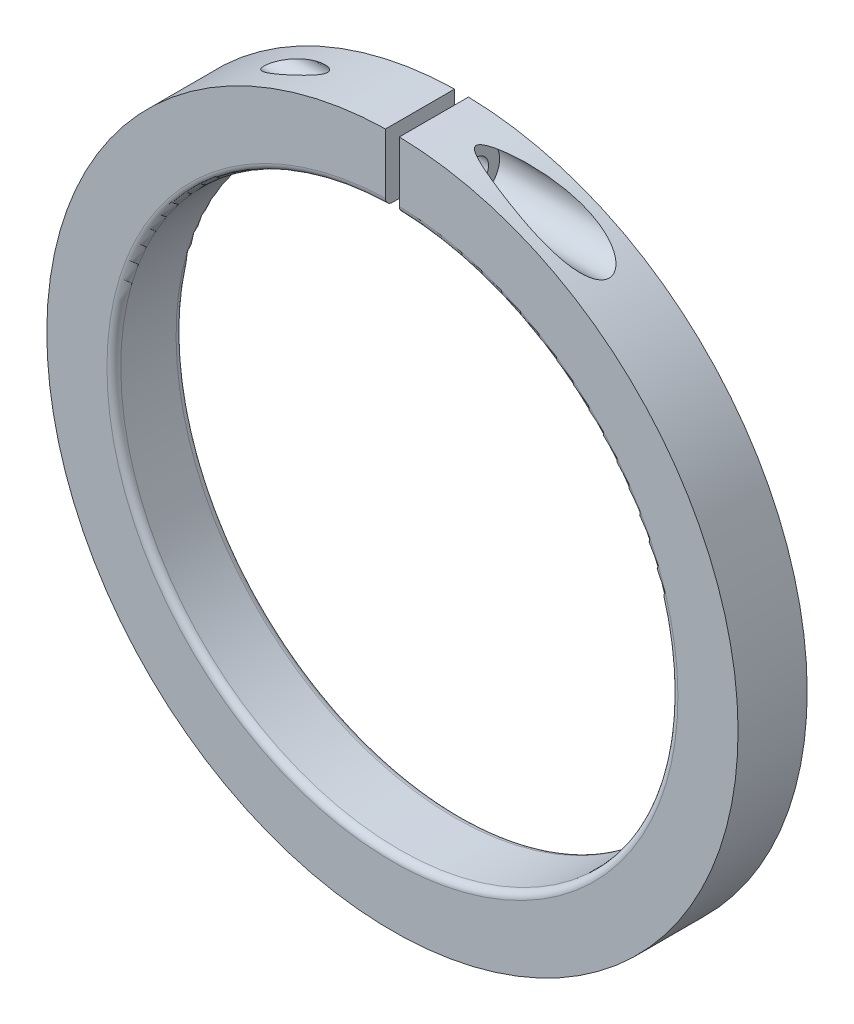
ISO-10303-21;
HEADER;
FILE_DESCRIPTION(('STEP AP214'),'2;1');
FILE_NAME('part.step','',(''),(''),'','','');
FILE_SCHEMA(('AUTOMOTIVE_DESIGN { 1 0 10303 214 1 1 1 1 }'));
ENDSEC;
DATA;
#1=APPLICATION_CONTEXT('core data for automotive mechanical design processes');
#2=APPLICATION_PROTOCOL_DEFINITION('international standard','automotive_design',2000,#1);
#3=PRODUCT_CONTEXT('',#1,'mechanical');
#4=PRODUCT('Part','Part','',(#3));
#5=PRODUCT_RELATED_PRODUCT_CATEGORY('part','',(#4));
#6=PRODUCT_DEFINITION_FORMATION('','',#4);
#7=PRODUCT_DEFINITION_CONTEXT('part definition',#1,'design');
#8=PRODUCT_DEFINITION('design','',#6,#7);
#9=PRODUCT_DEFINITION_SHAPE('','',#8);
#10=(LENGTH_UNIT() NAMED_UNIT(*) SI_UNIT(.MILLI.,.METRE.));
#11=(NAMED_UNIT(*) PLANE_ANGLE_UNIT() SI_UNIT($,.RADIAN.));
#12=(NAMED_UNIT(*) SI_UNIT($,.STERADIAN.) SOLID_ANGLE_UNIT());
#13=UNCERTAINTY_MEASURE_WITH_UNIT(LENGTH_MEASURE(1.E-05),#10,'distance_accuracy_value','');
#14=(GEOMETRIC_REPRESENTATION_CONTEXT(3) GLOBAL_UNCERTAINTY_ASSIGNED_CONTEXT((#13)) GLOBAL_UNIT_ASSIGNED_CONTEXT((#10,
#11,#12)) REPRESENTATION_CONTEXT('',''));
#15=CARTESIAN_POINT('',(0.,0.,0.));
#16=DIRECTION('',(0.,0.,1.));
#17=DIRECTION('',(1.,0.,0.));
#18=AXIS2_PLACEMENT_3D('',#15,#16,#17);
#19=CARTESIAN_POINT('',(0.,0.,5.));
#20=DIRECTION('',(0.,0.,-1.));
#21=DIRECTION('',(-1.,0.,0.));
#22=AXIS2_PLACEMENT_3D('',#19,#20,#21);
#23=CYLINDRICAL_SURFACE('',#22,25.);
#24=CARTESIAN_POINT('',(0.,0.,5.));
#25=DIRECTION('',(0.,0.,1.));
#26=DIRECTION('',(1.,0.,0.));
#27=AXIS2_PLACEMENT_3D('',#24,#25,#26);
#28=CIRCLE('',#27,25.);
#29=CARTESIAN_POINT('',(-0.5,24.9949994999,5.));
#30=VERTEX_POINT('',#29);
#31=CARTESIAN_POINT('',(0.5,24.9949994999,5.));
#32=VERTEX_POINT('',#31);
#33=EDGE_CURVE('E120',#30,#32,#28,.T.);
#34=ORIENTED_EDGE('',*,*,#33,.F.);
#35=DIRECTION('',(0.,0.,-1.));
#36=VECTOR('',#35,1.);
#37=CARTESIAN_POINT('',(-0.5,24.9949994999,5.));
#38=LINE('',#37,#36);
#39=CARTESIAN_POINT('',(-0.5,24.9949994999,0.));
#40=VERTEX_POINT('',#39);
#41=EDGE_CURVE('E101',#30,#40,#38,.T.);
#42=ORIENTED_EDGE('',*,*,#41,.T.);
#43=CARTESIAN_POINT('',(0.,0.,0.));
#44=DIRECTION('',(0.,0.,1.));
#45=DIRECTION('',(1.,0.,0.));
#46=AXIS2_PLACEMENT_3D('',#43,#44,#45);
#47=CIRCLE('',#46,25.);
#48=CARTESIAN_POINT('',(0.5,24.9949994999,0.));
#49=VERTEX_POINT('',#48);
#50=EDGE_CURVE('E115',#40,#49,#47,.T.);
#51=ORIENTED_EDGE('',*,*,#50,.T.);
#52=DIRECTION('',(0.,0.,-1.));
#53=VECTOR('',#52,1.);
#54=CARTESIAN_POINT('',(0.5,24.9949994999,5.));
#55=LINE('',#54,#53);
#56=EDGE_CURVE('E114',#49,#32,#55,.F.);
#57=ORIENTED_EDGE('',*,*,#56,.T.);
#58=EDGE_LOOP('',(#34,#42,#51,#57));
#59=FACE_BOUND('',#58,.T.);
#60=CARTESIAN_POINT('',(-9.80968898587514,22.9949994999,1.55));
#61=CARTESIAN_POINT('',(-9.6614554414756,23.0582356479893,1.54999470098165));
#62=CARTESIAN_POINT('',(-9.51259786901688,23.1200414737587,1.55626801966185));
#63=CARTESIAN_POINT('',(-9.21436837494512,23.2405100256196,1.58021625637692));
#64=CARTESIAN_POINT('',(-9.06499608755943,23.2991695425634,1.59790258452722));
#65=CARTESIAN_POINT('',(-8.84163488972135,23.384435385216,1.63295153394719));
#66=CARTESIAN_POINT('',(-8.76745069458317,23.4123482682588,1.64601851891765));
#67=CARTESIAN_POINT('',(-8.61933810129603,23.4672803071521,1.67512496003944));
#68=CARTESIAN_POINT('',(-8.54540967501988,23.4942995642663,1.69116407802569));
#69=CARTESIAN_POINT('',(-8.39807387449646,23.5473667031665,1.72643396314691));
#70=CARTESIAN_POINT('',(-8.32466595978119,23.5734157695303,1.74566067066929));
#71=CARTESIAN_POINT('',(-8.17855245670283,23.6245056031432,1.78773660673581));
#72=CARTESIAN_POINT('',(-8.10584668362592,23.64954664139,1.81058485340101));
#73=CARTESIAN_POINT('',(-7.97272507394479,23.6947209114633,1.85675390619561));
#74=CARTESIAN_POINT('',(-7.91215011971328,23.7150135023846,1.8794532250462));
#75=CARTESIAN_POINT('',(-7.79214082033805,23.754716285061,1.92874276253199));
#76=CARTESIAN_POINT('',(-7.73270901144953,23.7741246219743,1.95534070715406));
#77=CARTESIAN_POINT('',(-7.61544367316455,23.8119469643335,2.0138573712448));
#78=CARTESIAN_POINT('',(-7.5576264374168,23.8303519247726,2.04581638389602));
#79=CARTESIAN_POINT('',(-7.4741397708974,23.8566152841998,2.09936813611858));
#80=CARTESIAN_POINT('',(-7.44687628763853,23.8651379040079,2.11813279074379));
#81=CARTESIAN_POINT('',(-7.39397117769334,23.8815818422441,2.15803559098963));
#82=CARTESIAN_POINT('',(-7.36832728995629,23.8895040021886,2.17917030800262));
#83=CARTESIAN_POINT('',(-7.32352696784256,23.9032719684504,2.22082114088267));
#84=CARTESIAN_POINT('',(-7.30399266248104,23.9092462084236,2.24088247469748));
#85=CARTESIAN_POINT('',(-7.26773014059235,23.92029377022,2.28362936321626));
#86=CARTESIAN_POINT('',(-7.25099436110427,23.9253695224403,2.30630755573454));
#87=CARTESIAN_POINT('',(-7.22727977191373,23.9325410681651,2.34586013340062));
#88=CARTESIAN_POINT('',(-7.21896556243191,23.9350494289261,2.36184802536338));
#89=CARTESIAN_POINT('',(-7.20477850908732,23.9393237467223,2.39497720764643));
#90=CARTESIAN_POINT('',(-7.19890300920608,23.9410905114595,2.41211721940957));
#91=CARTESIAN_POINT('',(-7.19017811486175,23.9437123432399,2.44746068325797));
#92=CARTESIAN_POINT('',(-7.18736494318626,23.9445564976341,2.46567423403223));
#93=CARTESIAN_POINT('',(-7.18531129101205,23.9451728600485,2.50231687826273));
#94=CARTESIAN_POINT('',(-7.18606809148584,23.9449458838826,2.52074579701779));
#95=CARTESIAN_POINT('',(-7.19065977216838,23.943567315611,2.55442269892156));
#96=CARTESIAN_POINT('',(-7.1940312270493,23.9425549230254,2.56974366530478));
#97=CARTESIAN_POINT('',(-7.20294262913063,23.9398755059393,2.59967677704393));
#98=CARTESIAN_POINT('',(-7.20848420562508,23.9382079895788,2.61428838053514));
#99=CARTESIAN_POINT('',(-7.22507410534209,23.9332073672078,2.65093470435527));
#100=CARTESIAN_POINT('',(-7.23744718112769,23.9294706237273,2.6723092342026));
#101=CARTESIAN_POINT('',(-7.26513512784459,23.9210790741574,2.71285450650959));
#102=CARTESIAN_POINT('',(-7.28045909835952,23.9164214270854,2.7320181311148));
#103=CARTESIAN_POINT('',(-7.3283595329723,23.9018037468616,2.7855873557819));
#104=CARTESIAN_POINT('',(-7.36358965744614,23.8909819687285,2.81734533935886));
#105=CARTESIAN_POINT('',(-7.43756386519906,23.868057537509,2.87583258715045));
#106=CARTESIAN_POINT('',(-7.47631879758132,23.8559509092625,2.90254548963179));
#107=CARTESIAN_POINT('',(-7.54852998795815,23.8331880763148,2.94771985237663));
#108=CARTESIAN_POINT('',(-7.58165113057154,23.8226741999559,2.96679554001947));
#109=CARTESIAN_POINT('',(-7.64881478132508,23.8011949006392,3.0029820099325));
#110=CARTESIAN_POINT('',(-7.68285770049206,23.7902292750677,3.02009189719645));
#111=CARTESIAN_POINT('',(-7.78606387175225,23.7567345293418,3.06906469690121));
#112=CARTESIAN_POINT('',(-7.85619271156788,23.7336427127811,3.09850474608506));
#113=CARTESIAN_POINT('',(-7.99819813108952,23.6861663475805,3.15275187381495));
#114=CARTESIAN_POINT('',(-8.07008192766671,23.6617756753635,3.17753394383352));
#115=CARTESIAN_POINT('',(-8.21464170631745,23.6119778901309,3.2231709565902));
#116=CARTESIAN_POINT('',(-8.28731682159366,23.5865718210512,3.24402981297284));
#117=CARTESIAN_POINT('',(-8.44067206662296,23.5321553542388,3.28436265847057));
#118=CARTESIAN_POINT('',(-8.52140994592843,23.5030422543044,3.30347619013976));
#119=CARTESIAN_POINT('',(-8.68327376960856,23.44372396288,3.33804642382826));
#120=CARTESIAN_POINT('',(-8.76439978397026,23.4135185674553,3.35350243887201));
#121=CARTESIAN_POINT('',(-9.0082582676985,23.3212669171147,3.39476764389921));
#122=CARTESIAN_POINT('',(-9.17129088495086,23.2576490768975,3.41542805801566));
#123=CARTESIAN_POINT('',(-9.49650882542963,23.1267583705395,3.44318487671383));
#124=CARTESIAN_POINT('',(-9.65869523270257,23.0594967183807,3.4503207082894));
#125=CARTESIAN_POINT('',(-9.90074813236489,22.9561078607046,3.44982416636147));
#126=CARTESIAN_POINT('',(-9.98118688102548,22.9212474343786,3.44779585914673));
#127=CARTESIAN_POINT('',(-10.1415139279441,22.8507627045193,3.43965767817829));
#128=CARTESIAN_POINT('',(-10.2214023355268,22.8151385588395,3.43354864014864));
#129=CARTESIAN_POINT('',(-10.3774897320198,22.7445547658823,3.41708338002041));
#130=CARTESIAN_POINT('',(-10.4537164478957,22.7096187794745,3.40689141696416));
#131=CARTESIAN_POINT('',(-10.6052000445466,22.6392735572103,3.38167847202872));
#132=CARTESIAN_POINT('',(-10.6804565148589,22.6038641331872,3.36665551188673));
#133=CARTESIAN_POINT('',(-10.829482712193,22.5328450342149,3.33095942083693));
#134=CARTESIAN_POINT('',(-10.9032535075183,22.4972355285566,3.31029051775063));
#135=CARTESIAN_POINT('',(-11.0485612525125,22.426230819702,3.26213057713161));
#136=CARTESIAN_POINT('',(-11.1201006052385,22.3908354215663,3.23464718536093));
#137=CARTESIAN_POINT('',(-11.2603142611764,22.3206511353898,3.17084426081747));
#138=CARTESIAN_POINT('',(-11.3289673552609,22.2858675627145,3.13446943140931));
#139=CARTESIAN_POINT('',(-11.4271925456581,22.2355713347808,3.07138339436777));
#140=CARTESIAN_POINT('',(-11.4590738855563,22.2191547688014,3.048995354173));
#141=CARTESIAN_POINT('',(-11.5207038954772,22.1872615824335,3.00089320722487));
#142=CARTESIAN_POINT('',(-11.5504553246894,22.1717837500894,2.97518352925243));
#143=CARTESIAN_POINT('',(-11.601610052697,22.1450516959461,2.92512721515039));
#144=CARTESIAN_POINT('',(-11.6235278078947,22.1335524262913,2.90144303652077));
#145=CARTESIAN_POINT('',(-11.6646947027089,22.1118845395266,2.85122110516303));
#146=CARTESIAN_POINT('',(-11.6839414735745,22.1017171039907,2.82468085610344));
#147=CARTESIAN_POINT('',(-11.7189492620019,22.083175170219,2.76826925397457));
#148=CARTESIAN_POINT('',(-11.7346645475893,22.0748242351501,2.73836098056581));
#149=CARTESIAN_POINT('',(-11.7609058882508,22.0608548678435,2.67576191201371));
#150=CARTESIAN_POINT('',(-11.7714464342667,22.0552288056838,2.64307919117547));
#151=CARTESIAN_POINT('',(-11.7841563204193,22.0484397903242,2.58458864730315));
#152=CARTESIAN_POINT('',(-11.7877852509255,22.0464990820127,2.55918751604169));
#153=CARTESIAN_POINT('',(-11.7911678728412,22.0446901694636,2.50805489043345));
#154=CARTESIAN_POINT('',(-11.790923357927,22.044821005956,2.48232355450996));
#155=CARTESIAN_POINT('',(-11.7865844994757,22.0471411100156,2.43132838960544));
#156=CARTESIAN_POINT('',(-11.7824956142962,22.0493274591013,2.40606394956022));
#157=CARTESIAN_POINT('',(-11.7708362820686,22.0555538646761,2.3565937860906));
#158=CARTESIAN_POINT('',(-11.7632630872685,22.0595953841604,2.33238891477877));
#159=CARTESIAN_POINT('',(-11.7417101130908,22.0710770417196,2.27647372215903));
#160=CARTESIAN_POINT('',(-11.7263880714529,22.0792257263724,2.24542941568052));
#161=CARTESIAN_POINT('',(-11.6915669261632,22.0976843482309,2.18649614322305));
#162=CARTESIAN_POINT('',(-11.6720582936144,22.1079992146113,2.15861460092641));
#163=CARTESIAN_POINT('',(-11.6171238417217,22.1369349132949,2.08967899646697));
#164=CARTESIAN_POINT('',(-11.5792891408204,22.1567617413887,2.05107334550905));
#165=CARTESIAN_POINT('',(-11.4989512506868,22.1985628604928,1.98050545339089));
#166=CARTESIAN_POINT('',(-11.4564357502254,22.2205427969458,1.94856140343902));
#167=CARTESIAN_POINT('',(-11.3696424379676,22.2650746114248,1.89090541962708));
#168=CARTESIAN_POINT('',(-11.3254432027018,22.2875950235141,1.86504850548447));
#169=CARTESIAN_POINT('',(-11.2351078840111,22.3332693190383,1.81757899798548));
#170=CARTESIAN_POINT('',(-11.1889699934022,22.3564237861994,1.79597047644973));
#171=CARTESIAN_POINT('',(-11.09529134284,22.4030634394481,1.75632762986634));
#172=CARTESIAN_POINT('',(-11.0477491082684,22.4265489585756,1.73829722722032));
#173=CARTESIAN_POINT('',(-10.9516517232395,22.4736332577312,1.70532898154193));
#174=CARTESIAN_POINT('',(-10.9030962371539,22.4972320732287,1.69039218172119));
#175=CARTESIAN_POINT('',(-10.7700353980596,22.5613617816844,1.65344574716378));
#176=CARTESIAN_POINT('',(-10.684783473707,22.6018671257351,1.63407252551297));
#177=CARTESIAN_POINT('',(-10.5128030368549,22.6823721430005,1.6018687456786));
#178=CARTESIAN_POINT('',(-10.4260736653133,22.7223714967057,1.58904213813034));
#179=CARTESIAN_POINT('',(-10.251446338168,22.8016899053775,1.56897464767259));
#180=CARTESIAN_POINT('',(-10.1635462684637,22.8410073100703,1.56174585145807));
#181=CARTESIAN_POINT('',(-9.98706853200088,22.9187208705715,1.5522596233744));
#182=CARTESIAN_POINT('',(-9.89849073473799,22.9571168427428,1.55000317446431));
#183=CARTESIAN_POINT('',(-9.80968898587514,22.9949994999,1.55));
#184=B_SPLINE_CURVE_WITH_KNOTS('',3,(#60,#61,#62,#63,#64,#65,#66,#67,#68,#69,#70,#71,#72,#73,
#74,#75,#76,#77,#78,#79,#80,#81,#82,#83,#84,#85,#86,#87,#88,#89,#90,#91,#92,#93,#94,#95,#96,#97,
#98,#99,#100,#101,#102,#103,#104,#105,#106,#107,#108,#109,#110,#111,#112,#113,#114,#115,#116,
#117,#118,#119,#120,#121,#122,#123,#124,#125,#126,#127,#128,#129,#130,#131,#132,#133,#134,#135,
#136,#137,#138,#139,#140,#141,#142,#143,#144,#145,#146,#147,#148,#149,#150,#151,#152,#153,#154,
#155,#156,#157,#158,#159,#160,#161,#162,#163,#164,#165,#166,#167,#168,#169,#170,#171,#172,#173,
#174,#175,#176,#177,#178,#179,#180,#181,#182,#183),.UNSPECIFIED.,.T.,.F.,(4,2,2,2,2,2,2,2,2,2,2,
2,2,2,2,2,2,2,2,2,2,2,2,2,2,2,2,2,2,2,2,2,2,2,2,2,2,2,2,2,2,2,2,2,2,2,2,2,2,2,2,2,2,2,2,2,2,2,2,
2,2,4),(0.,0.483406420514402,0.967296875182562,1.20824346623344,1.44916265953752,
1.68977735017999,1.93032691612234,2.13361322762904,2.33730798336026,2.54260856274769,
2.64505503428313,2.74735517013642,2.83307716807418,2.91856362285704,2.97297849968767,
3.02733395633523,3.08232559616407,3.13727535901979,3.18423754404819,3.23123505537154,
3.30573707750801,3.38047262866092,3.52561066948369,3.67121161592891,3.79005476109592,
3.90895180153875,4.14714780352139,4.38658826024941,4.62578857877199,4.8894798838211,
5.15322067762795,5.68129056901141,6.20781864381383,6.47081201205975,6.73375153639042,
6.98703226667733,7.24041684617991,7.49361220274483,7.74652475301741,8.00105209997329,
8.1277337433844,8.25424819082132,8.35682572778503,8.45949366165757,8.56342299425467,
8.66705960706548,8.74390698365873,8.82071877558118,8.89742167214128,8.97418516112081,
9.08027946340225,9.18661785253688,9.3583745575137,9.53059431790592,9.69816413099381,
9.8658937746883,10.0338062832662,10.2017753227258,10.4905145494906,10.7794278141082,
11.0689631690749,11.3585557557401),.UNSPECIFIED.);
#185=CARTESIAN_POINT('',(-9.80968898587514,22.9949994999,1.55));
#186=VERTEX_POINT('',#185);
#187=EDGE_CURVE('E119',#186,#186,#184,.T.);
#188=ORIENTED_EDGE('',*,*,#187,.T.);
#189=EDGE_LOOP('',(#188));
#190=FACE_BOUND('',#189,.T.);
#191=CARTESIAN_POINT('',(9.80968898587514,22.9949994999,4.25));
#192=CARTESIAN_POINT('',(9.97517570979928,22.9244026772595,4.25000035728195));
#193=CARTESIAN_POINT('',(10.1399076115832,22.8520147158243,4.24574372677595));
#194=CARTESIAN_POINT('',(10.4674022843315,22.7038716090631,4.22722995439904));
#195=CARTESIAN_POINT('',(10.6301642414534,22.6281151287083,4.21296881379872));
#196=CARTESIAN_POINT('',(10.9527622046273,22.4737394454237,4.17247051902198));
#197=CARTESIAN_POINT('',(11.1125995345031,22.3951215884015,4.14623893007695));
#198=CARTESIAN_POINT('',(11.4280562243793,22.2357963741255,4.07911356192529));
#199=CARTESIAN_POINT('',(11.5836798964717,22.1550913320847,4.03823543243175));
#200=CARTESIAN_POINT('',(11.812647128031,22.0333594144928,3.96288194269295));
#201=CARTESIAN_POINT('',(11.888408665379,21.9925668398176,3.93533811089256));
#202=CARTESIAN_POINT('',(12.0378297880022,21.9111358911143,3.87488748055123));
#203=CARTESIAN_POINT('',(12.1114902499631,21.8704974590927,3.84198295842279));
#204=CARTESIAN_POINT('',(12.2557891780477,21.7899616932448,3.77015106292135));
#205=CARTESIAN_POINT('',(12.3264389403584,21.750061979819,3.73124931253322));
#206=CARTESIAN_POINT('',(12.4640410289817,21.6715006696579,3.64638285339066));
#207=CARTESIAN_POINT('',(12.5309970357833,21.6328378572173,3.60042535437338));
#208=CARTESIAN_POINT('',(12.6528317007594,21.5617779609387,3.50572742287631));
#209=CARTESIAN_POINT('',(12.7082315263492,21.5291570587022,3.45783512510839));
#210=CARTESIAN_POINT('',(12.8135681899102,21.4666304007198,3.35453825391925));
#211=CARTESIAN_POINT('',(12.8634978234494,21.4367282342492,3.29912398372182));
#212=CARTESIAN_POINT('',(12.9561904370232,21.3808347341691,3.17927060462737));
#213=CARTESIAN_POINT('',(12.9988455182497,21.354902782165,3.11471795343166));
#214=CARTESIAN_POINT('',(13.072664379792,21.3097942347129,2.97723768413726));
#215=CARTESIAN_POINT('',(13.1038703517043,21.2905928480889,2.90434214135282));
#216=CARTESIAN_POINT('',(13.1430305053687,21.2664310131014,2.77783113307368));
#217=CARTESIAN_POINT('',(13.1552796693399,21.2588502026321,2.72604050739255));
#218=CARTESIAN_POINT('',(13.1721955293152,21.2483732976972,2.62076611702995));
#219=CARTESIAN_POINT('',(13.1768676077907,21.2454738777575,2.56728358177448));
#220=CARTESIAN_POINT('',(13.1782246019364,21.2446322013995,2.4600944103195));
#221=CARTESIAN_POINT('',(13.1748969989,21.2466977146076,2.40638755434072));
#222=CARTESIAN_POINT('',(13.1605249247106,21.2556028370586,2.30042387207519));
#223=CARTESIAN_POINT('',(13.1494766267678,21.2624448137711,2.2481677782241));
#224=CARTESIAN_POINT('',(13.1206212808173,21.2802626224979,2.1467033732537));
#225=CARTESIAN_POINT('',(13.1028567350083,21.2912124556115,2.09747811434737));
#226=CARTESIAN_POINT('',(13.0616673049051,21.3165061146896,2.0024223914542));
#227=CARTESIAN_POINT('',(13.0382402592513,21.3308512365824,1.95659323249708));
#228=CARTESIAN_POINT('',(12.9698990440931,21.372509995045,1.8396808232458));
#229=CARTESIAN_POINT('',(12.9209765011974,21.4021541619018,1.77177422156744));
#230=CARTESIAN_POINT('',(12.8144641130329,21.466098619032,1.64560115410871));
#231=CARTESIAN_POINT('',(12.7568480175344,21.5004129791289,1.58736504702534));
#232=CARTESIAN_POINT('',(12.6450083403268,21.566346891628,1.48785568957111));
#233=CARTESIAN_POINT('',(12.5916254930575,21.5975694233016,1.44535106960589));
#234=CARTESIAN_POINT('',(12.4816326954261,21.6613224235599,1.36580135152491));
#235=CARTESIAN_POINT('',(12.4250204259425,21.6938538270066,1.32876024710626));
#236=CARTESIAN_POINT('',(12.3092820399546,21.7597338446421,1.25947326809167));
#237=CARTESIAN_POINT('',(12.2501525140163,21.7930835394752,1.22723418151502));
#238=CARTESIAN_POINT('',(12.1299692401384,21.8602057210193,1.16704373195648));
#239=CARTESIAN_POINT('',(12.0689147667368,21.8939783641668,1.13909400938065));
#240=CARTESIAN_POINT('',(11.8863799280545,21.993927915465,1.06217689611121));
#241=CARTESIAN_POINT('',(11.7627531467089,22.0603196199211,1.01855765141615));
#242=CARTESIAN_POINT('',(11.5115914315068,22.1924191041145,0.943033765077537));
#243=CARTESIAN_POINT('',(11.3840529091579,22.2581261769997,0.911140250956115));
#244=CARTESIAN_POINT('',(11.1260445574378,22.3882119941274,0.857052889260517));
#245=CARTESIAN_POINT('',(10.9955704520818,22.452588498083,0.834874303107217));
#246=CARTESIAN_POINT('',(10.7326570887064,22.5794459655204,0.79877694049695));
#247=CARTESIAN_POINT('',(10.6002184466733,22.641927505217,0.784855628807315));
#248=CARTESIAN_POINT('',(10.329891395251,22.7665576134428,0.763790302130344));
#249=CARTESIAN_POINT('',(10.1919574100706,22.8286420909367,0.756858131622156));
#250=CARTESIAN_POINT('',(9.91482379514126,22.9503634636679,0.749507404721791));
#251=CARTESIAN_POINT('',(9.77562391801467,23.0099998673831,0.74909015007053));
#252=CARTESIAN_POINT('',(9.49613785114368,23.1267446897248,0.753987525359021));
#253=CARTESIAN_POINT('',(9.35585084364825,23.1838509320645,0.759306993712271));
#254=CARTESIAN_POINT('',(9.07450552344404,23.2954128764802,0.775058872945365));
#255=CARTESIAN_POINT('',(8.93344712294679,23.3498682695867,0.785491878271732));
#256=CARTESIAN_POINT('',(8.50848873554683,23.5095162203126,0.823754071210193));
#257=CARTESIAN_POINT('',(8.22365974282337,23.6106339341661,0.858524898135555));
#258=CARTESIAN_POINT('',(7.65286416139898,23.8017693873197,0.943543590887996));
#259=CARTESIAN_POINT('',(7.36689841073098,23.891794140252,0.993781606397733));
#260=CARTESIAN_POINT('',(6.8566176109031,24.0424918374408,1.09584987800688));
#261=CARTESIAN_POINT('',(6.63238207174371,24.1052962127425,1.14497200589513));
#262=CARTESIAN_POINT('',(6.18399278774561,24.2242034271169,1.25181137044312));
#263=CARTESIAN_POINT('',(5.95983918994323,24.2803018994772,1.30953415327062));
#264=CARTESIAN_POINT('',(5.62502624786447,24.3592313365773,1.40317925775488));
#265=CARTESIAN_POINT('',(5.51394300243978,24.384612607806,1.43547875242895));
#266=CARTESIAN_POINT('',(5.29223225026304,24.4336890464932,1.50279767235038));
#267=CARTESIAN_POINT('',(5.18160470610099,24.4573843550657,1.53781686944591));
#268=CARTESIAN_POINT('',(4.96119663616258,24.5030443699757,1.61108960228347));
#269=CARTESIAN_POINT('',(4.85141534472633,24.5250108625587,1.6493397127334));
#270=CARTESIAN_POINT('',(4.63308764093816,24.5671901792933,1.73006086795011));
#271=CARTESIAN_POINT('',(4.52454077870973,24.5874036613505,1.77253031624567));
#272=CARTESIAN_POINT('',(4.35750271108635,24.6173892128383,1.84341868501923));
#273=CARTESIAN_POINT('',(4.29821711486135,24.6278073059236,1.86968753523747));
#274=CARTESIAN_POINT('',(4.18062265880639,24.6480415053556,1.92482872881792));
#275=CARTESIAN_POINT('',(4.12231550211996,24.6578566280676,1.95370514587049));
#276=CARTESIAN_POINT('',(4.01155694500494,24.6761087000361,2.01290505913691));
#277=CARTESIAN_POINT('',(3.95898258305011,24.6845940267336,2.04298285437112));
#278=CARTESIAN_POINT('',(3.85663803197944,24.7007891816058,2.10768449391639));
#279=CARTESIAN_POINT('',(3.80685953826056,24.7085013663988,2.14229373288491));
#280=CARTESIAN_POINT('',(3.74087383300131,24.7185405807355,2.19642919846879));
#281=CARTESIAN_POINT('',(3.7221876582399,24.7213602108847,2.2128067220201));
#282=CARTESIAN_POINT('',(3.68627708951949,24.7267403600064,2.24725482203351));
#283=CARTESIAN_POINT('',(3.66905665069587,24.7293001812795,2.26532971878111));
#284=CARTESIAN_POINT('',(3.63669850560896,24.7340796227254,2.30382701173003));
#285=CARTESIAN_POINT('',(3.62159681885188,24.7362934189366,2.3242811777302));
#286=CARTESIAN_POINT('',(3.59536345224032,24.7401199964847,2.36763668022253));
#287=CARTESIAN_POINT('',(3.58420888743465,24.7417362448671,2.39052287519087));
#288=CARTESIAN_POINT('',(3.57139889904333,24.7435877200376,2.4283568523763));
#289=CARTESIAN_POINT('',(3.56772146750648,24.7441178758317,2.44259861526805));
#290=CARTESIAN_POINT('',(3.56280024264406,24.7448269518521,2.4715055415535));
#291=CARTESIAN_POINT('',(3.56155386375865,24.7450062452408,2.48617023826393));
#292=CARTESIAN_POINT('',(3.56165040545669,24.7449923498192,2.51551316383252));
#293=CARTESIAN_POINT('',(3.56299731320154,24.744798587438,2.53019137879182));
#294=CARTESIAN_POINT('',(3.56811636371696,24.7440609441293,2.55911137194114));
#295=CARTESIAN_POINT('',(3.57189142013257,24.7435166425729,2.5733526042377));
#296=CARTESIAN_POINT('',(3.58323603627323,24.7418766944576,2.60621570482506));
#297=CARTESIAN_POINT('',(3.59169072993702,24.740651865921,2.62452110279514));
#298=CARTESIAN_POINT('',(3.61129801505808,24.7377975150439,2.65958089414388));
#299=CARTESIAN_POINT('',(3.6224575353115,24.7361669530695,2.67633114889381));
#300=CARTESIAN_POINT('',(3.6573234810558,24.7310433630842,2.7226853938606));
#301=CARTESIAN_POINT('',(3.68335900984215,24.727184050682,2.75046553660598));
#302=CARTESIAN_POINT('',(3.73871653303421,24.7188753955492,2.80238719708884));
#303=CARTESIAN_POINT('',(3.76805000956611,24.7144239808542,2.82651527027383));
#304=CARTESIAN_POINT('',(3.85430038713014,24.701164900062,2.89163902767161));
#305=CARTESIAN_POINT('',(3.91345879429772,24.6918721479688,2.92952776358918));
#306=CARTESIAN_POINT('',(4.03461721944224,24.6723668105979,3.00025960463147));
#307=CARTESIAN_POINT('',(4.09662472609942,24.6621517240349,3.03308829337862));
#308=CARTESIAN_POINT('',(4.22255047689835,24.6409042054878,3.09547442797569));
#309=CARTESIAN_POINT('',(4.28647721197683,24.6298676684756,3.12501330701669));
#310=CARTESIAN_POINT('',(4.41520347604229,24.6071179539738,3.18153860200982));
#311=CARTESIAN_POINT('',(4.48000167921667,24.5954057310064,3.20852848320034));
#312=CARTESIAN_POINT('',(4.67445102090549,24.5594539961967,3.2862883408713));
#313=CARTESIAN_POINT('',(4.8050411175349,24.5342507464377,3.33426160021742));
#314=CARTESIAN_POINT('',(5.06749791407857,24.4813893401427,3.42514056968524));
#315=CARTESIAN_POINT('',(5.19936508690279,24.4537302405995,3.4680443183282));
#316=CARTESIAN_POINT('',(5.46401460523976,24.3959609925303,3.54991513113027));
#317=CARTESIAN_POINT('',(5.59679805236757,24.3658471117577,3.58887599108945));
#318=CARTESIAN_POINT('',(5.86276636762479,24.3032229770269,3.66336247505726));
#319=CARTESIAN_POINT('',(5.99595126877302,24.2707125204945,3.69888780808478));
#320=CARTESIAN_POINT('',(6.3950051610884,24.1697957318099,3.80057096067385));
#321=CARTESIAN_POINT('',(6.66117748743055,24.0978289156233,3.86207923082274));
#322=CARTESIAN_POINT('',(7.19303503546515,23.9444524143541,3.97308166163972));
#323=CARTESIAN_POINT('',(7.45872047998531,23.863051333653,4.02258664425561));
#324=CARTESIAN_POINT('',(7.89913483074361,23.7199836346013,4.09403199752485));
#325=CARTESIAN_POINT('',(8.07414565375502,23.6609894838246,4.11962629522837));
#326=CARTESIAN_POINT('',(8.42356038659096,23.5388589842156,4.16461856008761));
#327=CARTESIAN_POINT('',(8.59796419612974,23.4757219822362,4.18401554735485));
#328=CARTESIAN_POINT('',(8.94600213435289,23.3453122375534,4.21589334340718));
#329=CARTESIAN_POINT('',(9.11963565392506,23.2780366913075,4.22836940519057));
#330=CARTESIAN_POINT('',(9.46567953729838,23.1394821916012,4.24542200324027));
#331=CARTESIAN_POINT('',(9.63809006660599,23.0682037919524,4.24999962952196));
#332=CARTESIAN_POINT('',(9.80968898587514,22.9949994999,4.25));
#333=B_SPLINE_CURVE_WITH_KNOTS('',3,(#191,#192,#193,#194,#195,#196,#197,#198,#199,#200,#201,
#202,#203,#204,#205,#206,#207,#208,#209,#210,#211,#212,#213,#214,#215,#216,#217,#218,#219,#220,
#221,#222,#223,#224,#225,#226,#227,#228,#229,#230,#231,#232,#233,#234,#235,#236,#237,#238,#239,
#240,#241,#242,#243,#244,#245,#246,#247,#248,#249,#250,#251,#252,#253,#254,#255,#256,#257,#258,
#259,#260,#261,#262,#263,#264,#265,#266,#267,#268,#269,#270,#271,#272,#273,#274,#275,#276,#277,
#278,#279,#280,#281,#282,#283,#284,#285,#286,#287,#288,#289,#290,#291,#292,#293,#294,#295,#296,
#297,#298,#299,#300,#301,#302,#303,#304,#305,#306,#307,#308,#309,#310,#311,#312,#313,#314,#315,
#316,#317,#318,#319,#320,#321,#322,#323,#324,#325,#326,#327,#328,#329,#330,#331,#332),
.UNSPECIFIED.,.T.,.F.,(4,2,2,2,2,2,2,2,2,2,2,2,2,2,2,2,2,2,2,2,2,2,2,2,2,2,2,2,2,2,2,2,2,2,2,2,
2,2,2,2,2,2,2,2,2,2,2,2,2,2,2,2,2,2,2,2,2,2,2,2,2,2,2,2,2,2,2,2,2,2,4),(0.,0.539684734091489,
1.07958529920952,1.61923511221292,2.15831002481177,2.42920596544896,2.69998716877818,
2.96964198718609,3.23902307737669,3.47906743762041,3.71942423750935,3.96308362127302,
4.20583584558692,4.36642765908686,4.52690534426153,4.68763432449835,4.84844302718462,
5.00825067585356,5.16811941922842,5.43296006120513,5.69861701502791,5.92342285251445,
6.14839221178343,6.37367662445256,6.59904698037488,7.03915191623654,7.47967343281564,
7.9208845151884,8.36196006221626,8.816035681859,9.27020202888236,9.72475172444249,
10.1793542737509,11.0913303602116,12.002726849642,12.7164689904748,13.4306733989415,
13.7859467976619,14.1411904251447,14.4960620533532,14.8507999164573,15.0477908914656,
15.245095124848,15.4284837300697,15.611295170789,15.6862464116394,15.7613938805868,
15.8376946340743,15.9135454626287,15.9575186044328,16.0014449527962,16.0454388915702,
16.0894857193876,16.1497413446568,16.2101529855863,16.3243160074412,16.438889584088,
16.6509070573221,16.8635178392875,17.0772734829337,17.2907342222385,17.7146994098987,
18.1388281033472,18.5636141194354,18.988436082455,19.8355091194688,20.6818155870154,
21.2410391055837,21.8003510021376,22.36004605295,22.919663857449),.UNSPECIFIED.);
#334=CARTESIAN_POINT('',(9.80968898587514,22.9949994999,4.25));
#335=VERTEX_POINT('',#334);
#336=EDGE_CURVE('E145',#335,#335,#333,.T.);
#337=ORIENTED_EDGE('',*,*,#336,.F.);
#338=EDGE_LOOP('',(#337));
#339=FACE_BOUND('',#338,.T.);
#340=ADVANCED_FACE('F44',(#59,#190,#339),#23,.T.);
#341=CARTESIAN_POINT('',(-25.,22.9949994999,2.5));
#342=DIRECTION('',(1.,0.,0.));
#343=DIRECTION('',(0.,0.,-1.));
#344=AXIS2_PLACEMENT_3D('',#341,#342,#343);
#345=CYLINDRICAL_SURFACE('',#344,0.95);
#346=CARTESIAN_POINT('',(0.5,22.9949994999,2.5));
#347=DIRECTION('',(1.,0.,0.));
#348=DIRECTION('',(0.,0.,-1.));
#349=AXIS2_PLACEMENT_3D('',#346,#347,#348);
#350=CIRCLE('',#349,0.95);
#351=CARTESIAN_POINT('',(0.5,22.9949994999,1.55));
#352=VERTEX_POINT('',#351);
#353=EDGE_CURVE('E141',#352,#352,#350,.T.);
#354=ORIENTED_EDGE('',*,*,#353,.F.);
#355=EDGE_LOOP('',(#354));
#356=FACE_BOUND('',#355,.T.);
#357=CARTESIAN_POINT('',(3.5,22.9949994999,2.5));
#358=DIRECTION('',(1.,0.,0.));
#359=DIRECTION('',(0.,0.,-1.));
#360=AXIS2_PLACEMENT_3D('',#357,#358,#359);
#361=CIRCLE('',#360,0.95);
#362=CARTESIAN_POINT('',(3.5,22.9949994999,1.55));
#363=VERTEX_POINT('',#362);
#364=EDGE_CURVE('E144',#363,#363,#361,.F.);
#365=ORIENTED_EDGE('',*,*,#364,.F.);
#366=EDGE_LOOP('',(#365));
#367=FACE_BOUND('',#366,.T.);
#368=ADVANCED_FACE('F171',(#356,#367),#345,.F.);
#369=CARTESIAN_POINT('',(0.,0.,5.));
#370=DIRECTION('',(0.,0.,1.));
#371=DIRECTION('',(1.,0.,0.));
#372=AXIS2_PLACEMENT_3D('',#369,#370,#371);
#373=PLANE('',#372);
#374=DIRECTION('',(0.,1.,0.));
#375=VECTOR('',#374,1.);
#376=CARTESIAN_POINT('',(0.5,0.,5.));
#377=LINE('',#376,#375);
#378=CARTESIAN_POINT('',(0.5,20.6439458437577,5.));
#379=VERTEX_POINT('',#378);
#380=EDGE_CURVE('E117',#379,#32,#377,.T.);
#381=ORIENTED_EDGE('',*,*,#380,.F.);
#382=CARTESIAN_POINT('',(0.,0.,5.));
#383=DIRECTION('',(0.,0.,1.));
#384=DIRECTION('',(1.,0.,0.));
#385=AXIS2_PLACEMENT_3D('',#382,#383,#384);
#386=CIRCLE('',#385,20.65);
#387=CARTESIAN_POINT('',(-0.5,20.6439458437577,5.));
#388=VERTEX_POINT('',#387);
#389=EDGE_CURVE('E11',#379,#388,#386,.F.);
#390=ORIENTED_EDGE('',*,*,#389,.T.);
#391=DIRECTION('',(0.,-1.,0.));
#392=VECTOR('',#391,1.);
#393=CARTESIAN_POINT('',(-0.5,0.,5.));
#394=LINE('',#393,#392);
#395=EDGE_CURVE('E103',#30,#388,#394,.T.);
#396=ORIENTED_EDGE('',*,*,#395,.F.);
#397=ORIENTED_EDGE('',*,*,#33,.T.);
#398=EDGE_LOOP('',(#381,#390,#396,#397));
#399=FACE_BOUND('',#398,.T.);
#400=ADVANCED_FACE('F118',(#399),#373,.T.);
#401=CARTESIAN_POINT('',(0.,0.,0.));
#402=DIRECTION('',(0.,0.,1.));
#403=DIRECTION('',(1.,0.,0.));
#404=AXIS2_PLACEMENT_3D('',#401,#402,#403);
#405=PLANE('',#404);
#406=DIRECTION('',(0.,-1.,0.));
#407=VECTOR('',#406,1.);
#408=CARTESIAN_POINT('',(-0.5,0.,0.));
#409=LINE('',#408,#407);
#410=CARTESIAN_POINT('',(-0.5,20.6439458437577,0.));
#411=VERTEX_POINT('',#410);
#412=EDGE_CURVE('E106',#40,#411,#409,.T.);
#413=ORIENTED_EDGE('',*,*,#412,.T.);
#414=CARTESIAN_POINT('',(0.,0.,0.));
#415=DIRECTION('',(0.,0.,1.));
#416=DIRECTION('',(1.,0.,0.));
#417=AXIS2_PLACEMENT_3D('',#414,#415,#416);
#418=CIRCLE('',#417,20.65);
#419=CARTESIAN_POINT('',(0.5,20.6439458437577,0.));
#420=VERTEX_POINT('',#419);
#421=EDGE_CURVE('E139',#411,#420,#418,.T.);
#422=ORIENTED_EDGE('',*,*,#421,.T.);
#423=DIRECTION('',(0.,1.,0.));
#424=VECTOR('',#423,1.);
#425=CARTESIAN_POINT('',(0.5,0.,0.));
#426=LINE('',#425,#424);
#427=EDGE_CURVE('E186',#420,#49,#426,.T.);
#428=ORIENTED_EDGE('',*,*,#427,.T.);
#429=ORIENTED_EDGE('',*,*,#50,.F.);
#430=EDGE_LOOP('',(#413,#422,#428,#429));
#431=FACE_BOUND('',#430,.T.);
#432=ADVANCED_FACE('F211',(#431),#405,.F.);
#433=CARTESIAN_POINT('',(0.,0.,5.));
#434=DIRECTION('',(0.,0.,-1.));
#435=DIRECTION('',(-1.,0.,0.));
#436=AXIS2_PLACEMENT_3D('',#433,#434,#435);
#437=CYLINDRICAL_SURFACE('',#436,20.15);
#438=DIRECTION('',(0.,0.,-1.));
#439=VECTOR('',#438,1.);
#440=CARTESIAN_POINT('',(0.5,20.1437955708451,5.));
#441=LINE('',#440,#439);
#442=CARTESIAN_POINT('',(0.5,20.1437955708451,0.5));
#443=VERTEX_POINT('',#442);
#444=CARTESIAN_POINT('',(0.5,20.1437955708451,4.5));
#445=VERTEX_POINT('',#444);
#446=EDGE_CURVE('E127',#443,#445,#441,.F.);
#447=ORIENTED_EDGE('',*,*,#446,.F.);
#448=CARTESIAN_POINT('',(0.,0.,0.5));
#449=DIRECTION('',(0.,0.,1.));
#450=DIRECTION('',(1.,0.,0.));
#451=AXIS2_PLACEMENT_3D('',#448,#449,#450);
#452=CIRCLE('',#451,20.15);
#453=CARTESIAN_POINT('',(-0.5,20.1437955708451,0.5));
#454=VERTEX_POINT('',#453);
#455=EDGE_CURVE('E69',#443,#454,#452,.F.);
#456=ORIENTED_EDGE('',*,*,#455,.T.);
#457=DIRECTION('',(0.,0.,-1.));
#458=VECTOR('',#457,1.);
#459=CARTESIAN_POINT('',(-0.5,20.1437955708451,5.));
#460=LINE('',#459,#458);
#461=CARTESIAN_POINT('',(-0.5,20.1437955708451,4.5));
#462=VERTEX_POINT('',#461);
#463=EDGE_CURVE('E133',#462,#454,#460,.T.);
#464=ORIENTED_EDGE('',*,*,#463,.F.);
#465=CARTESIAN_POINT('',(0.,0.,4.5));
#466=DIRECTION('',(0.,0.,1.));
#467=DIRECTION('',(1.,0.,0.));
#468=AXIS2_PLACEMENT_3D('',#465,#466,#467);
#469=CIRCLE('',#468,20.15);
#470=EDGE_CURVE('E270',#462,#445,#469,.T.);
#471=ORIENTED_EDGE('',*,*,#470,.T.);
#472=EDGE_LOOP('',(#447,#456,#464,#471));
#473=FACE_BOUND('',#472,.T.);
#474=ADVANCED_FACE('F252',(#473),#437,.F.);
#475=CARTESIAN_POINT('',(0.5,0.,0.));
#476=DIRECTION('',(1.,0.,0.));
#477=DIRECTION('',(0.,0.,-1.));
#478=AXIS2_PLACEMENT_3D('',#475,#476,#477);
#479=PLANE('',#478);
#480=ORIENTED_EDGE('',*,*,#353,.T.);
#481=EDGE_LOOP('',(#480));
#482=FACE_BOUND('',#481,.T.);
#483=ORIENTED_EDGE('',*,*,#427,.F.);
#484=CARTESIAN_POINT('',(0.5,20.6439458437577,0.));
#485=CARTESIAN_POINT('',(0.5,20.6158022025465,-2.38616419614515E-05));
#486=CARTESIAN_POINT('',(0.5,20.5876656571242,0.00237337468937021));
#487=CARTESIAN_POINT('',(0.5,20.5322096905438,0.0118339808622653));
#488=CARTESIAN_POINT('',(0.5,20.5048896523922,0.0188937292574492));
#489=CARTESIAN_POINT('',(0.5,20.4518107267541,0.0375082918733813));
#490=CARTESIAN_POINT('',(0.5,20.4260525996731,0.0490652755531909));
#491=CARTESIAN_POINT('',(0.5,20.3768466835455,0.0763365836624224));
#492=CARTESIAN_POINT('',(0.5,20.3533984833182,0.0920501663506359));
#493=CARTESIAN_POINT('',(0.5,20.3094766472386,0.127189405157941));
#494=CARTESIAN_POINT('',(0.5,20.2890026112659,0.146614561135969));
#495=CARTESIAN_POINT('',(0.5,20.2516033163673,0.188631785032994));
#496=CARTESIAN_POINT('',(0.5,20.2346787503228,0.211224469842384));
#497=CARTESIAN_POINT('',(0.5,20.2048666687334,0.258927070245534));
#498=CARTESIAN_POINT('',(0.5,20.1919788049124,0.284036768431098));
#499=CARTESIAN_POINT('',(0.5,20.170609604834,0.336058895590281));
#500=CARTESIAN_POINT('',(0.5,20.1621256682466,0.362970250140327));
#501=CARTESIAN_POINT('',(0.5,20.1519190187845,0.408372603081444));
#502=CARTESIAN_POINT('',(0.5,20.1488745667608,0.426577438580761));
#503=CARTESIAN_POINT('',(0.5,20.1448131148071,0.463185632523548));
#504=CARTESIAN_POINT('',(0.5,20.1437932406665,0.481588672186696));
#505=CARTESIAN_POINT('',(0.5,20.1437955708451,0.500000000000001));
#506=B_SPLINE_CURVE_WITH_KNOTS('',3,(#484,#485,#486,#487,#488,#489,#490,#491,#492,#493,#494,
#495,#496,#497,#498,#499,#500,#501,#502,#503,#504,#505),.UNSPECIFIED.,.F.,.F.,(4,2,2,2,2,2,2,2,
2,2,4),(0.,0.0843188525226218,0.168572290169108,0.252866422023791,0.33714552180515,
0.421413272827902,0.505697458228078,0.58997436980561,0.674201462720758,0.729469600520918,
0.784659220126264),.UNSPECIFIED.);
#507=EDGE_CURVE('E232',#420,#443,#506,.T.);
#508=ORIENTED_EDGE('',*,*,#507,.T.);
#509=ORIENTED_EDGE('',*,*,#446,.T.);
#510=CARTESIAN_POINT('',(0.5,20.1437955708451,4.5));
#511=CARTESIAN_POINT('',(0.5,20.1437716428001,4.52812291798779));
#512=CARTESIAN_POINT('',(0.5,20.146167564452,4.55623864572386));
#513=CARTESIAN_POINT('',(0.5,20.1556224738479,4.61165292196945));
#514=CARTESIAN_POINT('',(0.5,20.1626777622692,4.6389521008223));
#515=CARTESIAN_POINT('',(0.5,20.1812797235202,4.69199021367668));
#516=CARTESIAN_POINT('',(0.5,20.1928285386131,4.71772839670722));
#517=CARTESIAN_POINT('',(0.5,20.2200792007929,4.76689687270032));
#518=CARTESIAN_POINT('',(0.5,20.2357803266907,4.79032756546764));
#519=CARTESIAN_POINT('',(0.5,20.2708945691445,4.83422429238468));
#520=CARTESIAN_POINT('',(0.5,20.2903081632628,4.85468994452334));
#521=CARTESIAN_POINT('',(0.5,20.3322992327946,4.89207678272841));
#522=CARTESIAN_POINT('',(0.5,20.3548773283492,4.90899727243077));
#523=CARTESIAN_POINT('',(0.5,20.4025619551279,4.9388160080887));
#524=CARTESIAN_POINT('',(0.5,20.4276697067166,4.95171230026778));
#525=CARTESIAN_POINT('',(0.5,20.4796886436972,4.97310122978526));
#526=CARTESIAN_POINT('',(0.5,20.5065987697941,4.98159642853663));
#527=CARTESIAN_POINT('',(0.5,20.5520515964926,4.99183616070242));
#528=CARTESIAN_POINT('',(0.5,20.5703088951185,4.99489574665901));
#529=CARTESIAN_POINT('',(0.5,20.6070235315788,4.99897740156467));
#530=CARTESIAN_POINT('',(0.5,20.6254805485274,5.00000235774682));
#531=CARTESIAN_POINT('',(0.5,20.6439458437577,5.));
#532=B_SPLINE_CURVE_WITH_KNOTS('',3,(#510,#511,#512,#513,#514,#515,#516,#517,#518,#519,#520,
#521,#522,#523,#524,#525,#526,#527,#528,#529,#530,#531),.UNSPECIFIED.,.F.,.F.,(4,2,2,2,2,2,2,2,
2,2,4),(0.,0.0842565648017395,0.168446314066228,0.252676249590616,0.336891565336837,
0.421117721618193,0.505360406675505,0.589643928746163,0.673878342993462,0.729308401521594,
0.784659745861641),.UNSPECIFIED.);
#533=EDGE_CURVE('E263',#445,#379,#532,.T.);
#534=ORIENTED_EDGE('',*,*,#533,.T.);
#535=ORIENTED_EDGE('',*,*,#380,.T.);
#536=ORIENTED_EDGE('',*,*,#56,.F.);
#537=EDGE_LOOP('',(#483,#508,#509,#534,#535,#536));
#538=FACE_BOUND('',#537,.T.);
#539=ADVANCED_FACE('F172',(#482,#538),#479,.F.);
#540=CARTESIAN_POINT('',(-0.5,0.,0.));
#541=DIRECTION('',(-1.,0.,0.));
#542=DIRECTION('',(0.,0.,1.));
#543=AXIS2_PLACEMENT_3D('',#540,#541,#542);
#544=PLANE('',#543);
#545=CARTESIAN_POINT('',(-0.5,22.9949994999,2.5));
#546=DIRECTION('',(-1.,0.,0.));
#547=DIRECTION('',(0.,0.,1.));
#548=AXIS2_PLACEMENT_3D('',#545,#546,#547);
#549=CIRCLE('',#548,0.95);
#550=CARTESIAN_POINT('',(-0.5,22.9949994999,3.45));
#551=VERTEX_POINT('',#550);
#552=EDGE_CURVE('E136',#551,#551,#549,.T.);
#553=ORIENTED_EDGE('',*,*,#552,.T.);
#554=EDGE_LOOP('',(#553));
#555=FACE_BOUND('',#554,.T.);
#556=ORIENTED_EDGE('',*,*,#463,.T.);
#557=CARTESIAN_POINT('',(-0.5,20.1437955708451,0.5));
#558=CARTESIAN_POINT('',(-0.5,20.1437716428001,0.471877082012212));
#559=CARTESIAN_POINT('',(-0.5,20.146167564452,0.443761354276146));
#560=CARTESIAN_POINT('',(-0.5,20.1556224738479,0.388347078030554));
#561=CARTESIAN_POINT('',(-0.5,20.1626777622692,0.361047899177704));
#562=CARTESIAN_POINT('',(-0.5,20.1812797235202,0.308009786323316));
#563=CARTESIAN_POINT('',(-0.5,20.1928285386131,0.282271603292783));
#564=CARTESIAN_POINT('',(-0.5,20.2200792007929,0.233103127299681));
#565=CARTESIAN_POINT('',(-0.5,20.2357803266907,0.209672434532357));
#566=CARTESIAN_POINT('',(-0.5,20.2708945691445,0.165775707615319));
#567=CARTESIAN_POINT('',(-0.5,20.2903081632628,0.145310055476664));
#568=CARTESIAN_POINT('',(-0.5,20.3322992327946,0.107923217271586));
#569=CARTESIAN_POINT('',(-0.5,20.3548773283492,0.0910027275692323));
#570=CARTESIAN_POINT('',(-0.5,20.4025619551279,0.0611839919113023));
#571=CARTESIAN_POINT('',(-0.5,20.4276697067166,0.0482876997322246));
#572=CARTESIAN_POINT('',(-0.5,20.4796886436972,0.0268987702147439));
#573=CARTESIAN_POINT('',(-0.5,20.5065987697941,0.0184035714633727));
#574=CARTESIAN_POINT('',(-0.5,20.5520515964926,0.0081638392975851));
#575=CARTESIAN_POINT('',(-0.5,20.5703088951185,0.00510425334099159));
#576=CARTESIAN_POINT('',(-0.5,20.6070235315788,0.00102259843533267));
#577=CARTESIAN_POINT('',(-0.5,20.6254805485274,-2.35774682192545E-06));
#578=CARTESIAN_POINT('',(-0.5,20.6439458437577,0.));
#579=B_SPLINE_CURVE_WITH_KNOTS('',3,(#557,#558,#559,#560,#561,#562,#563,#564,#565,#566,#567,
#568,#569,#570,#571,#572,#573,#574,#575,#576,#577,#578),.UNSPECIFIED.,.F.,.F.,(4,2,2,2,2,2,2,2,
2,2,4),(0.,0.0842565648017384,0.168446314066228,0.252676249590616,0.336891565336837,
0.421117721618193,0.505360406675505,0.589643928746163,0.673878342993462,0.729308401521594,
0.784659745861642),.UNSPECIFIED.);
#580=EDGE_CURVE('E54',#454,#411,#579,.T.);
#581=ORIENTED_EDGE('',*,*,#580,.T.);
#582=ORIENTED_EDGE('',*,*,#412,.F.);
#583=ORIENTED_EDGE('',*,*,#41,.F.);
#584=ORIENTED_EDGE('',*,*,#395,.T.);
#585=CARTESIAN_POINT('',(-0.5,20.6439458437577,5.));
#586=CARTESIAN_POINT('',(-0.5,20.6158022025465,5.00002386164196));
#587=CARTESIAN_POINT('',(-0.5,20.5876656571242,4.99762662531063));
#588=CARTESIAN_POINT('',(-0.5,20.5322096905438,4.98816601913773));
#589=CARTESIAN_POINT('',(-0.5,20.5048896523922,4.98110627074255));
#590=CARTESIAN_POINT('',(-0.5,20.4518107267541,4.96249170812662));
#591=CARTESIAN_POINT('',(-0.5,20.4260525996731,4.95093472444681));
#592=CARTESIAN_POINT('',(-0.5,20.3768466835455,4.92366341633758));
#593=CARTESIAN_POINT('',(-0.5,20.3533984833182,4.90794983364936));
#594=CARTESIAN_POINT('',(-0.5,20.3094766472386,4.87281059484206));
#595=CARTESIAN_POINT('',(-0.5,20.2890026112659,4.85338543886403));
#596=CARTESIAN_POINT('',(-0.5,20.2516033163673,4.81136821496701));
#597=CARTESIAN_POINT('',(-0.5,20.2346787503228,4.78877553015761));
#598=CARTESIAN_POINT('',(-0.5,20.2048666687334,4.74107292975447));
#599=CARTESIAN_POINT('',(-0.5,20.1919788049124,4.7159632315689));
#600=CARTESIAN_POINT('',(-0.5,20.170609604834,4.66394110440972));
#601=CARTESIAN_POINT('',(-0.5,20.1621256682466,4.63702974985967));
#602=CARTESIAN_POINT('',(-0.5,20.1519190187845,4.59162739691855));
#603=CARTESIAN_POINT('',(-0.5,20.1488745667608,4.57342256141924));
#604=CARTESIAN_POINT('',(-0.5,20.1448131148071,4.53681436747645));
#605=CARTESIAN_POINT('',(-0.5,20.1437932406665,4.5184113278133));
#606=CARTESIAN_POINT('',(-0.5,20.1437955708451,4.5));
#607=B_SPLINE_CURVE_WITH_KNOTS('',3,(#585,#586,#587,#588,#589,#590,#591,#592,#593,#594,#595,
#596,#597,#598,#599,#600,#601,#602,#603,#604,#605,#606),.UNSPECIFIED.,.F.,.F.,(4,2,2,2,2,2,2,2,
2,2,4),(0.,0.0843188525226218,0.168572290169108,0.252866422023791,0.33714552180515,
0.421413272827902,0.505697458228078,0.589974369805613,0.674201462720761,0.729469600520921,
0.784659220126265),.UNSPECIFIED.);
#608=EDGE_CURVE('E241',#388,#462,#607,.T.);
#609=ORIENTED_EDGE('',*,*,#608,.T.);
#610=EDGE_LOOP('',(#556,#581,#582,#583,#584,#609));
#611=FACE_BOUND('',#610,.T.);
#612=ADVANCED_FACE('F105',(#555,#611),#544,.F.);
#613=ORIENTED_EDGE('',*,*,#552,.F.);
#614=EDGE_LOOP('',(#613));
#615=FACE_BOUND('',#614,.T.);
#616=ORIENTED_EDGE('',*,*,#187,.F.);
#617=EDGE_LOOP('',(#616));
#618=FACE_BOUND('',#617,.T.);
#619=ADVANCED_FACE('F170',(#615,#618),#345,.F.);
#620=CARTESIAN_POINT('',(25.,22.9949994999,2.5));
#621=DIRECTION('',(-1.,0.,0.));
#622=DIRECTION('',(0.,0.,1.));
#623=AXIS2_PLACEMENT_3D('',#620,#621,#622);
#624=CYLINDRICAL_SURFACE('',#623,1.75);
#625=CARTESIAN_POINT('',(3.5,22.9949994999,2.5));
#626=DIRECTION('',(1.,0.,0.));
#627=DIRECTION('',(0.,0.,-1.));
#628=AXIS2_PLACEMENT_3D('',#625,#626,#627);
#629=CIRCLE('',#628,1.75);
#630=CARTESIAN_POINT('',(3.5,22.9949994999,0.75));
#631=VERTEX_POINT('',#630);
#632=EDGE_CURVE('E149',#631,#631,#629,.T.);
#633=ORIENTED_EDGE('',*,*,#632,.F.);
#634=EDGE_LOOP('',(#633));
#635=FACE_BOUND('',#634,.T.);
#636=ORIENTED_EDGE('',*,*,#336,.T.);
#637=EDGE_LOOP('',(#636));
#638=FACE_BOUND('',#637,.T.);
#639=ADVANCED_FACE('F161',(#635,#638),#624,.F.);
#640=CARTESIAN_POINT('',(3.5,22.9949994999,2.5));
#641=DIRECTION('',(1.,0.,0.));
#642=DIRECTION('',(0.,0.,-1.));
#643=AXIS2_PLACEMENT_3D('',#640,#641,#642);
#644=PLANE('',#643);
#645=ORIENTED_EDGE('',*,*,#632,.T.);
#646=EDGE_LOOP('',(#645));
#647=FACE_BOUND('',#646,.T.);
#648=ORIENTED_EDGE('',*,*,#364,.T.);
#649=EDGE_LOOP('',(#648));
#650=FACE_BOUND('',#649,.T.);
#651=ADVANCED_FACE('F167',(#647,#650),#644,.T.);
#652=CARTESIAN_POINT('',(0.,0.,0.5));
#653=DIRECTION('',(0.,0.,1.));
#654=DIRECTION('',(1.,0.,0.));
#655=AXIS2_PLACEMENT_3D('',#652,#653,#654);
#656=TOROIDAL_SURFACE('',#655,20.65,0.5);
#657=ORIENTED_EDGE('',*,*,#580,.F.);
#658=ORIENTED_EDGE('',*,*,#455,.F.);
#659=ORIENTED_EDGE('',*,*,#507,.F.);
#660=ORIENTED_EDGE('',*,*,#421,.F.);
#661=EDGE_LOOP('',(#657,#658,#659,#660));
#662=FACE_BOUND('',#661,.T.);
#663=ADVANCED_FACE('F220',(#662),#656,.T.);
#664=CARTESIAN_POINT('',(0.,0.,4.5));
#665=DIRECTION('',(0.,0.,1.));
#666=DIRECTION('',(1.,0.,0.));
#667=AXIS2_PLACEMENT_3D('',#664,#665,#666);
#668=TOROIDAL_SURFACE('',#667,20.65,0.5);
#669=ORIENTED_EDGE('',*,*,#608,.F.);
#670=ORIENTED_EDGE('',*,*,#389,.F.);
#671=ORIENTED_EDGE('',*,*,#533,.F.);
#672=ORIENTED_EDGE('',*,*,#470,.F.);
#673=EDGE_LOOP('',(#669,#670,#671,#672));
#674=FACE_BOUND('',#673,.T.);
#675=ADVANCED_FACE('F50',(#674),#668,.T.);
#676=CLOSED_SHELL('',(#340,#368,#400,#432,#474,#539,#612,#619,#639,#651,#663,#675));
#677=MANIFOLD_SOLID_BREP('B2',#676);
#678=ADVANCED_BREP_SHAPE_REPRESENTATION('',(#18,#677),#14);
#679=SHAPE_DEFINITION_REPRESENTATION(#9,#678);
ENDSEC;
END-ISO-10303-21;
